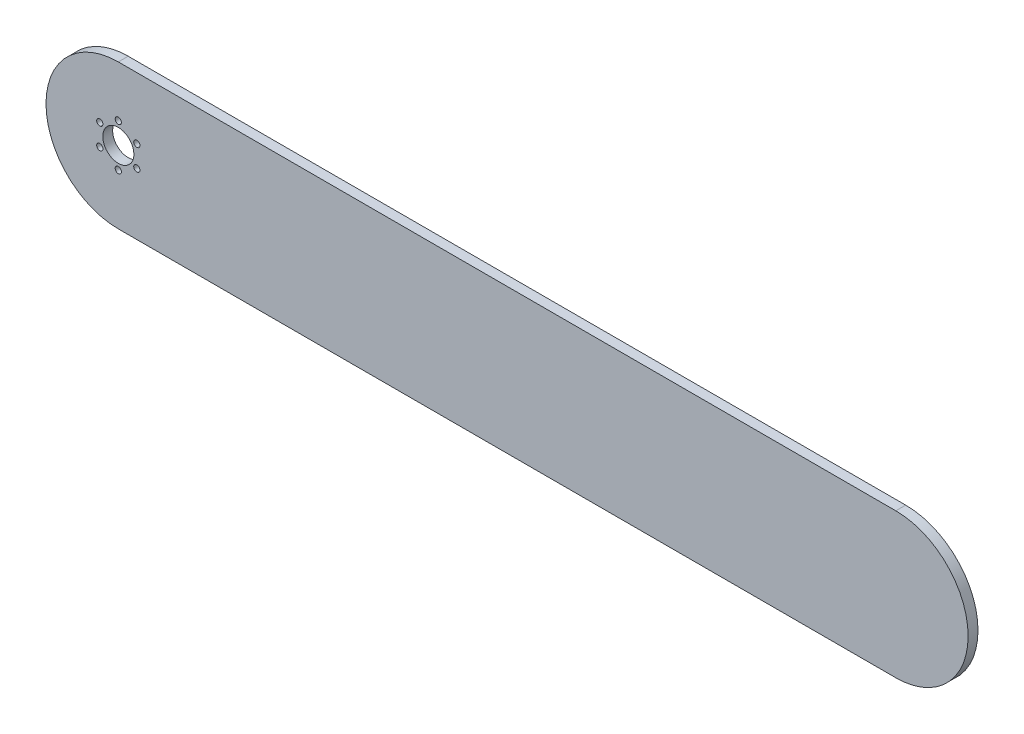
ISO-10303-21;
HEADER;
FILE_DESCRIPTION(('STEP AP214'),'2;1');
FILE_NAME('part.step','',(''),(''),'','','');
FILE_SCHEMA(('AUTOMOTIVE_DESIGN { 1 0 10303 214 1 1 1 1 }'));
ENDSEC;
DATA;
#1=APPLICATION_CONTEXT('core data for automotive mechanical design processes');
#2=APPLICATION_PROTOCOL_DEFINITION('international standard','automotive_design',2000,#1);
#3=PRODUCT_CONTEXT('',#1,'mechanical');
#4=PRODUCT('Part','Part','',(#3));
#5=PRODUCT_RELATED_PRODUCT_CATEGORY('part','',(#4));
#6=PRODUCT_DEFINITION_FORMATION('','',#4);
#7=PRODUCT_DEFINITION_CONTEXT('part definition',#1,'design');
#8=PRODUCT_DEFINITION('design','',#6,#7);
#9=PRODUCT_DEFINITION_SHAPE('','',#8);
#10=(LENGTH_UNIT() NAMED_UNIT(*) SI_UNIT(.MILLI.,.METRE.));
#11=(NAMED_UNIT(*) PLANE_ANGLE_UNIT() SI_UNIT($,.RADIAN.));
#12=(NAMED_UNIT(*) SI_UNIT($,.STERADIAN.) SOLID_ANGLE_UNIT());
#13=UNCERTAINTY_MEASURE_WITH_UNIT(LENGTH_MEASURE(1.E-05),#10,'distance_accuracy_value','');
#14=(GEOMETRIC_REPRESENTATION_CONTEXT(3) GLOBAL_UNCERTAINTY_ASSIGNED_CONTEXT((#13)) GLOBAL_UNIT_ASSIGNED_CONTEXT((#10,
#11,#12)) REPRESENTATION_CONTEXT('',''));
#15=CARTESIAN_POINT('',(0.,0.,0.));
#16=DIRECTION('',(0.,0.,1.));
#17=DIRECTION('',(1.,0.,0.));
#18=AXIS2_PLACEMENT_3D('',#15,#16,#17);
#19=CARTESIAN_POINT('',(0.,0.,6.35));
#20=DIRECTION('',(0.,0.,1.));
#21=DIRECTION('',(1.,0.,0.));
#22=AXIS2_PLACEMENT_3D('',#19,#20,#21);
#23=PLANE('',#22);
#24=CARTESIAN_POINT('',(-11.907849302036,-6.87500000000001,6.35));
#25=DIRECTION('',(0.,0.,1.));
#26=DIRECTION('',(1.,0.,0.));
#27=AXIS2_PLACEMENT_3D('',#24,#25,#26);
#28=CIRCLE('',#27,2.);
#29=CARTESIAN_POINT('',(-9.90784930203603,-6.87500000000001,6.35));
#30=VERTEX_POINT('',#29);
#31=EDGE_CURVE('E143',#30,#30,#28,.T.);
#32=ORIENTED_EDGE('',*,*,#31,.F.);
#33=EDGE_LOOP('',(#32));
#34=FACE_BOUND('',#33,.T.);
#35=CARTESIAN_POINT('',(11.907849302036,-6.875,6.35));
#36=DIRECTION('',(0.,0.,1.));
#37=DIRECTION('',(1.,0.,0.));
#38=AXIS2_PLACEMENT_3D('',#35,#36,#37);
#39=CIRCLE('',#38,2.);
#40=CARTESIAN_POINT('',(13.907849302036,-6.875,6.35));
#41=VERTEX_POINT('',#40);
#42=EDGE_CURVE('E131',#41,#41,#39,.T.);
#43=ORIENTED_EDGE('',*,*,#42,.F.);
#44=EDGE_LOOP('',(#43));
#45=FACE_BOUND('',#44,.T.);
#46=CARTESIAN_POINT('',(0.,13.75,6.35));
#47=DIRECTION('',(0.,0.,1.));
#48=DIRECTION('',(1.,0.,0.));
#49=AXIS2_PLACEMENT_3D('',#46,#47,#48);
#50=CIRCLE('',#49,2.);
#51=CARTESIAN_POINT('',(2.,13.75,6.35));
#52=VERTEX_POINT('',#51);
#53=EDGE_CURVE('E119',#52,#52,#50,.T.);
#54=ORIENTED_EDGE('',*,*,#53,.F.);
#55=EDGE_LOOP('',(#54));
#56=FACE_BOUND('',#55,.T.);
#57=CARTESIAN_POINT('',(0.,0.,6.35));
#58=DIRECTION('',(0.,0.,1.));
#59=DIRECTION('',(1.,0.,0.));
#60=AXIS2_PLACEMENT_3D('',#57,#58,#59);
#61=CIRCLE('',#60,46.5);
#62=CARTESIAN_POINT('',(0.,46.5,6.35));
#63=VERTEX_POINT('',#62);
#64=CARTESIAN_POINT('',(0.,-46.5,6.35));
#65=VERTEX_POINT('',#64);
#66=EDGE_CURVE('E89',#63,#65,#61,.T.);
#67=ORIENTED_EDGE('',*,*,#66,.T.);
#68=DIRECTION('',(1.,0.,0.));
#69=VECTOR('',#68,1.);
#70=CARTESIAN_POINT('',(0.,-46.5,6.35));
#71=LINE('',#70,#69);
#72=CARTESIAN_POINT('',(500.,-46.5,6.35));
#73=VERTEX_POINT('',#72);
#74=EDGE_CURVE('E84',#65,#73,#71,.T.);
#75=ORIENTED_EDGE('',*,*,#74,.T.);
#76=CARTESIAN_POINT('',(500.,0.,6.35));
#77=DIRECTION('',(0.,0.,1.));
#78=DIRECTION('',(1.,0.,0.));
#79=AXIS2_PLACEMENT_3D('',#76,#77,#78);
#80=CIRCLE('',#79,46.5);
#81=CARTESIAN_POINT('',(500.,46.5,6.35));
#82=VERTEX_POINT('',#81);
#83=EDGE_CURVE('E87',#73,#82,#80,.T.);
#84=ORIENTED_EDGE('',*,*,#83,.T.);
#85=DIRECTION('',(-1.,0.,0.));
#86=VECTOR('',#85,1.);
#87=CARTESIAN_POINT('',(0.,46.5,6.35));
#88=LINE('',#87,#86);
#89=EDGE_CURVE('E54',#82,#63,#88,.T.);
#90=ORIENTED_EDGE('',*,*,#89,.T.);
#91=EDGE_LOOP('',(#67,#75,#84,#90));
#92=FACE_BOUND('',#91,.T.);
#93=CARTESIAN_POINT('',(0.,0.,6.35));
#94=DIRECTION('',(0.,0.,1.));
#95=DIRECTION('',(1.,0.,0.));
#96=AXIS2_PLACEMENT_3D('',#93,#94,#95);
#97=CIRCLE('',#96,10.);
#98=CARTESIAN_POINT('',(10.,0.,6.35));
#99=VERTEX_POINT('',#98);
#100=EDGE_CURVE('E104',#99,#99,#97,.T.);
#101=ORIENTED_EDGE('',*,*,#100,.F.);
#102=EDGE_LOOP('',(#101));
#103=FACE_BOUND('',#102,.T.);
#104=CARTESIAN_POINT('',(11.907849302036,6.875,6.35));
#105=DIRECTION('',(0.,0.,1.));
#106=DIRECTION('',(1.,0.,0.));
#107=AXIS2_PLACEMENT_3D('',#104,#105,#106);
#108=CIRCLE('',#107,1.99999999999924);
#109=CARTESIAN_POINT('',(13.9078493020353,6.875,6.35));
#110=VERTEX_POINT('',#109);
#111=EDGE_CURVE('E125',#110,#110,#108,.T.);
#112=ORIENTED_EDGE('',*,*,#111,.F.);
#113=EDGE_LOOP('',(#112));
#114=FACE_BOUND('',#113,.T.);
#115=CARTESIAN_POINT('',(0.,-13.75,6.35));
#116=DIRECTION('',(0.,0.,1.));
#117=DIRECTION('',(1.,0.,0.));
#118=AXIS2_PLACEMENT_3D('',#115,#116,#117);
#119=CIRCLE('',#118,2.00000000000013);
#120=CARTESIAN_POINT('',(2.00000000000013,-13.75,6.35));
#121=VERTEX_POINT('',#120);
#122=EDGE_CURVE('E137',#121,#121,#119,.T.);
#123=ORIENTED_EDGE('',*,*,#122,.F.);
#124=EDGE_LOOP('',(#123));
#125=FACE_BOUND('',#124,.T.);
#126=CARTESIAN_POINT('',(-11.907849302036,6.87499999999999,6.35));
#127=DIRECTION('',(0.,0.,1.));
#128=DIRECTION('',(1.,0.,0.));
#129=AXIS2_PLACEMENT_3D('',#126,#127,#128);
#130=CIRCLE('',#129,2.00000000000043);
#131=CARTESIAN_POINT('',(-9.9078493020356,6.87499999999999,6.35));
#132=VERTEX_POINT('',#131);
#133=EDGE_CURVE('E149',#132,#132,#130,.T.);
#134=ORIENTED_EDGE('',*,*,#133,.F.);
#135=EDGE_LOOP('',(#134));
#136=FACE_BOUND('',#135,.T.);
#137=ADVANCED_FACE('F37',(#34,#45,#56,#92,#103,#114,#125,#136),#23,.T.);
#138=CARTESIAN_POINT('',(0.,0.,0.));
#139=DIRECTION('',(0.,0.,1.));
#140=DIRECTION('',(1.,0.,0.));
#141=AXIS2_PLACEMENT_3D('',#138,#139,#140);
#142=PLANE('',#141);
#143=CARTESIAN_POINT('',(0.,0.,0.));
#144=DIRECTION('',(0.,0.,1.));
#145=DIRECTION('',(1.,0.,0.));
#146=AXIS2_PLACEMENT_3D('',#143,#144,#145);
#147=CIRCLE('',#146,46.5);
#148=CARTESIAN_POINT('',(0.,46.5,0.));
#149=VERTEX_POINT('',#148);
#150=CARTESIAN_POINT('',(0.,-46.5,0.));
#151=VERTEX_POINT('',#150);
#152=EDGE_CURVE('E101',#149,#151,#147,.T.);
#153=ORIENTED_EDGE('',*,*,#152,.F.);
#154=DIRECTION('',(-1.,0.,0.));
#155=VECTOR('',#154,1.);
#156=CARTESIAN_POINT('',(0.,46.5,0.));
#157=LINE('',#156,#155);
#158=CARTESIAN_POINT('',(500.,46.5,0.));
#159=VERTEX_POINT('',#158);
#160=EDGE_CURVE('E77',#159,#149,#157,.T.);
#161=ORIENTED_EDGE('',*,*,#160,.F.);
#162=CARTESIAN_POINT('',(500.,0.,0.));
#163=DIRECTION('',(0.,0.,1.));
#164=DIRECTION('',(1.,0.,0.));
#165=AXIS2_PLACEMENT_3D('',#162,#163,#164);
#166=CIRCLE('',#165,46.5);
#167=CARTESIAN_POINT('',(500.,-46.5,0.));
#168=VERTEX_POINT('',#167);
#169=EDGE_CURVE('E71',#168,#159,#166,.T.);
#170=ORIENTED_EDGE('',*,*,#169,.F.);
#171=DIRECTION('',(1.,0.,0.));
#172=VECTOR('',#171,1.);
#173=CARTESIAN_POINT('',(0.,-46.5,0.));
#174=LINE('',#173,#172);
#175=EDGE_CURVE('E93',#151,#168,#174,.T.);
#176=ORIENTED_EDGE('',*,*,#175,.F.);
#177=EDGE_LOOP('',(#153,#161,#170,#176));
#178=FACE_BOUND('',#177,.T.);
#179=CARTESIAN_POINT('',(0.,0.,0.));
#180=DIRECTION('',(0.,0.,1.));
#181=DIRECTION('',(1.,0.,0.));
#182=AXIS2_PLACEMENT_3D('',#179,#180,#181);
#183=CIRCLE('',#182,10.);
#184=CARTESIAN_POINT('',(10.,0.,0.));
#185=VERTEX_POINT('',#184);
#186=EDGE_CURVE('E116',#185,#185,#183,.T.);
#187=ORIENTED_EDGE('',*,*,#186,.T.);
#188=EDGE_LOOP('',(#187));
#189=FACE_BOUND('',#188,.T.);
#190=CARTESIAN_POINT('',(0.,13.75,0.));
#191=DIRECTION('',(0.,0.,1.));
#192=DIRECTION('',(1.,0.,0.));
#193=AXIS2_PLACEMENT_3D('',#190,#191,#192);
#194=CIRCLE('',#193,2.);
#195=CARTESIAN_POINT('',(2.,13.75,0.));
#196=VERTEX_POINT('',#195);
#197=EDGE_CURVE('E122',#196,#196,#194,.T.);
#198=ORIENTED_EDGE('',*,*,#197,.T.);
#199=EDGE_LOOP('',(#198));
#200=FACE_BOUND('',#199,.T.);
#201=CARTESIAN_POINT('',(11.907849302036,6.875,0.));
#202=DIRECTION('',(0.,0.,1.));
#203=DIRECTION('',(1.,0.,0.));
#204=AXIS2_PLACEMENT_3D('',#201,#202,#203);
#205=CIRCLE('',#204,1.99999999999924);
#206=CARTESIAN_POINT('',(13.9078493020353,6.875,0.));
#207=VERTEX_POINT('',#206);
#208=EDGE_CURVE('E128',#207,#207,#205,.T.);
#209=ORIENTED_EDGE('',*,*,#208,.T.);
#210=EDGE_LOOP('',(#209));
#211=FACE_BOUND('',#210,.T.);
#212=CARTESIAN_POINT('',(11.907849302036,-6.875,0.));
#213=DIRECTION('',(0.,0.,1.));
#214=DIRECTION('',(1.,0.,0.));
#215=AXIS2_PLACEMENT_3D('',#212,#213,#214);
#216=CIRCLE('',#215,2.);
#217=CARTESIAN_POINT('',(13.907849302036,-6.875,0.));
#218=VERTEX_POINT('',#217);
#219=EDGE_CURVE('E134',#218,#218,#216,.T.);
#220=ORIENTED_EDGE('',*,*,#219,.T.);
#221=EDGE_LOOP('',(#220));
#222=FACE_BOUND('',#221,.T.);
#223=CARTESIAN_POINT('',(0.,-13.75,0.));
#224=DIRECTION('',(0.,0.,1.));
#225=DIRECTION('',(1.,0.,0.));
#226=AXIS2_PLACEMENT_3D('',#223,#224,#225);
#227=CIRCLE('',#226,2.00000000000013);
#228=CARTESIAN_POINT('',(2.00000000000013,-13.75,0.));
#229=VERTEX_POINT('',#228);
#230=EDGE_CURVE('E140',#229,#229,#227,.T.);
#231=ORIENTED_EDGE('',*,*,#230,.T.);
#232=EDGE_LOOP('',(#231));
#233=FACE_BOUND('',#232,.T.);
#234=CARTESIAN_POINT('',(-11.907849302036,-6.87500000000001,0.));
#235=DIRECTION('',(0.,0.,1.));
#236=DIRECTION('',(1.,0.,0.));
#237=AXIS2_PLACEMENT_3D('',#234,#235,#236);
#238=CIRCLE('',#237,2.);
#239=CARTESIAN_POINT('',(-9.90784930203603,-6.87500000000001,0.));
#240=VERTEX_POINT('',#239);
#241=EDGE_CURVE('E146',#240,#240,#238,.T.);
#242=ORIENTED_EDGE('',*,*,#241,.T.);
#243=EDGE_LOOP('',(#242));
#244=FACE_BOUND('',#243,.T.);
#245=CARTESIAN_POINT('',(-11.907849302036,6.87499999999999,0.));
#246=DIRECTION('',(0.,0.,1.));
#247=DIRECTION('',(1.,0.,0.));
#248=AXIS2_PLACEMENT_3D('',#245,#246,#247);
#249=CIRCLE('',#248,2.00000000000043);
#250=CARTESIAN_POINT('',(-9.9078493020356,6.87499999999999,0.));
#251=VERTEX_POINT('',#250);
#252=EDGE_CURVE('E152',#251,#251,#249,.T.);
#253=ORIENTED_EDGE('',*,*,#252,.T.);
#254=EDGE_LOOP('',(#253));
#255=FACE_BOUND('',#254,.T.);
#256=ADVANCED_FACE('F112',(#178,#189,#200,#211,#222,#233,#244,#255),#142,.F.);
#257=CARTESIAN_POINT('',(0.,0.,6.35));
#258=DIRECTION('',(0.,0.,-1.));
#259=DIRECTION('',(-1.,0.,0.));
#260=AXIS2_PLACEMENT_3D('',#257,#258,#259);
#261=CYLINDRICAL_SURFACE('',#260,46.5);
#262=ORIENTED_EDGE('',*,*,#152,.T.);
#263=DIRECTION('',(0.,0.,-1.));
#264=VECTOR('',#263,1.);
#265=CARTESIAN_POINT('',(0.,-46.5,6.35));
#266=LINE('',#265,#264);
#267=EDGE_CURVE('E11',#65,#151,#266,.T.);
#268=ORIENTED_EDGE('',*,*,#267,.F.);
#269=ORIENTED_EDGE('',*,*,#66,.F.);
#270=DIRECTION('',(0.,0.,-1.));
#271=VECTOR('',#270,1.);
#272=CARTESIAN_POINT('',(0.,46.5,6.35));
#273=LINE('',#272,#271);
#274=EDGE_CURVE('E97',#63,#149,#273,.T.);
#275=ORIENTED_EDGE('',*,*,#274,.T.);
#276=EDGE_LOOP('',(#262,#268,#269,#275));
#277=FACE_BOUND('',#276,.T.);
#278=ADVANCED_FACE('F39',(#277),#261,.T.);
#279=CARTESIAN_POINT('',(0.,-46.5,6.35));
#280=DIRECTION('',(0.,1.,0.));
#281=DIRECTION('',(0.,0.,1.));
#282=AXIS2_PLACEMENT_3D('',#279,#280,#281);
#283=PLANE('',#282);
#284=ORIENTED_EDGE('',*,*,#175,.T.);
#285=DIRECTION('',(0.,0.,-1.));
#286=VECTOR('',#285,1.);
#287=CARTESIAN_POINT('',(500.,-46.5,6.35));
#288=LINE('',#287,#286);
#289=EDGE_CURVE('E46',#73,#168,#288,.T.);
#290=ORIENTED_EDGE('',*,*,#289,.F.);
#291=ORIENTED_EDGE('',*,*,#74,.F.);
#292=ORIENTED_EDGE('',*,*,#267,.T.);
#293=EDGE_LOOP('',(#284,#290,#291,#292));
#294=FACE_BOUND('',#293,.T.);
#295=ADVANCED_FACE('F92',(#294),#283,.F.);
#296=CARTESIAN_POINT('',(500.,0.,6.35));
#297=DIRECTION('',(0.,0.,-1.));
#298=DIRECTION('',(-1.,0.,0.));
#299=AXIS2_PLACEMENT_3D('',#296,#297,#298);
#300=CYLINDRICAL_SURFACE('',#299,46.5);
#301=ORIENTED_EDGE('',*,*,#169,.T.);
#302=DIRECTION('',(0.,0.,-1.));
#303=VECTOR('',#302,1.);
#304=CARTESIAN_POINT('',(500.,46.5,6.35));
#305=LINE('',#304,#303);
#306=EDGE_CURVE('E94',#82,#159,#305,.T.);
#307=ORIENTED_EDGE('',*,*,#306,.F.);
#308=ORIENTED_EDGE('',*,*,#83,.F.);
#309=ORIENTED_EDGE('',*,*,#289,.T.);
#310=EDGE_LOOP('',(#301,#307,#308,#309));
#311=FACE_BOUND('',#310,.T.);
#312=ADVANCED_FACE('F95',(#311),#300,.T.);
#313=CARTESIAN_POINT('',(0.,46.5,6.35));
#314=DIRECTION('',(0.,-1.,0.));
#315=DIRECTION('',(0.,0.,-1.));
#316=AXIS2_PLACEMENT_3D('',#313,#314,#315);
#317=PLANE('',#316);
#318=ORIENTED_EDGE('',*,*,#160,.T.);
#319=ORIENTED_EDGE('',*,*,#274,.F.);
#320=ORIENTED_EDGE('',*,*,#89,.F.);
#321=ORIENTED_EDGE('',*,*,#306,.T.);
#322=EDGE_LOOP('',(#318,#319,#320,#321));
#323=FACE_BOUND('',#322,.T.);
#324=ADVANCED_FACE('F109',(#323),#317,.F.);
#325=CARTESIAN_POINT('',(0.,0.,6.35));
#326=DIRECTION('',(0.,0.,-1.));
#327=DIRECTION('',(-1.,0.,0.));
#328=AXIS2_PLACEMENT_3D('',#325,#326,#327);
#329=CYLINDRICAL_SURFACE('',#328,10.);
#330=ORIENTED_EDGE('',*,*,#100,.T.);
#331=EDGE_LOOP('',(#330));
#332=FACE_BOUND('',#331,.T.);
#333=ORIENTED_EDGE('',*,*,#186,.F.);
#334=EDGE_LOOP('',(#333));
#335=FACE_BOUND('',#334,.T.);
#336=ADVANCED_FACE('F171',(#332,#335),#329,.F.);
#337=CARTESIAN_POINT('',(0.,13.75,6.35));
#338=DIRECTION('',(0.,0.,-1.));
#339=DIRECTION('',(-1.,0.,0.));
#340=AXIS2_PLACEMENT_3D('',#337,#338,#339);
#341=CYLINDRICAL_SURFACE('',#340,2.);
#342=ORIENTED_EDGE('',*,*,#53,.T.);
#343=EDGE_LOOP('',(#342));
#344=FACE_BOUND('',#343,.T.);
#345=ORIENTED_EDGE('',*,*,#197,.F.);
#346=EDGE_LOOP('',(#345));
#347=FACE_BOUND('',#346,.T.);
#348=ADVANCED_FACE('F225',(#344,#347),#341,.F.);
#349=CARTESIAN_POINT('',(11.907849302036,6.875,6.35));
#350=DIRECTION('',(0.,0.,-1.));
#351=DIRECTION('',(-1.,0.,0.));
#352=AXIS2_PLACEMENT_3D('',#349,#350,#351);
#353=CYLINDRICAL_SURFACE('',#352,1.99999999999924);
#354=ORIENTED_EDGE('',*,*,#111,.T.);
#355=EDGE_LOOP('',(#354));
#356=FACE_BOUND('',#355,.T.);
#357=ORIENTED_EDGE('',*,*,#208,.F.);
#358=EDGE_LOOP('',(#357));
#359=FACE_BOUND('',#358,.T.);
#360=ADVANCED_FACE('F234',(#356,#359),#353,.F.);
#361=CARTESIAN_POINT('',(11.907849302036,-6.875,6.35));
#362=DIRECTION('',(0.,0.,-1.));
#363=DIRECTION('',(-1.,0.,0.));
#364=AXIS2_PLACEMENT_3D('',#361,#362,#363);
#365=CYLINDRICAL_SURFACE('',#364,2.);
#366=ORIENTED_EDGE('',*,*,#42,.T.);
#367=EDGE_LOOP('',(#366));
#368=FACE_BOUND('',#367,.T.);
#369=ORIENTED_EDGE('',*,*,#219,.F.);
#370=EDGE_LOOP('',(#369));
#371=FACE_BOUND('',#370,.T.);
#372=ADVANCED_FACE('F243',(#368,#371),#365,.F.);
#373=CARTESIAN_POINT('',(0.,-13.75,6.35));
#374=DIRECTION('',(0.,0.,-1.));
#375=DIRECTION('',(-1.,0.,0.));
#376=AXIS2_PLACEMENT_3D('',#373,#374,#375);
#377=CYLINDRICAL_SURFACE('',#376,2.00000000000013);
#378=ORIENTED_EDGE('',*,*,#122,.T.);
#379=EDGE_LOOP('',(#378));
#380=FACE_BOUND('',#379,.T.);
#381=ORIENTED_EDGE('',*,*,#230,.F.);
#382=EDGE_LOOP('',(#381));
#383=FACE_BOUND('',#382,.T.);
#384=ADVANCED_FACE('F253',(#380,#383),#377,.F.);
#385=CARTESIAN_POINT('',(-11.907849302036,-6.87500000000001,6.35));
#386=DIRECTION('',(0.,0.,-1.));
#387=DIRECTION('',(-1.,0.,0.));
#388=AXIS2_PLACEMENT_3D('',#385,#386,#387);
#389=CYLINDRICAL_SURFACE('',#388,2.);
#390=ORIENTED_EDGE('',*,*,#31,.T.);
#391=EDGE_LOOP('',(#390));
#392=FACE_BOUND('',#391,.T.);
#393=ORIENTED_EDGE('',*,*,#241,.F.);
#394=EDGE_LOOP('',(#393));
#395=FACE_BOUND('',#394,.T.);
#396=ADVANCED_FACE('F263',(#392,#395),#389,.F.);
#397=CARTESIAN_POINT('',(-11.907849302036,6.87499999999999,6.35));
#398=DIRECTION('',(0.,0.,-1.));
#399=DIRECTION('',(-1.,0.,0.));
#400=AXIS2_PLACEMENT_3D('',#397,#398,#399);
#401=CYLINDRICAL_SURFACE('',#400,2.00000000000043);
#402=ORIENTED_EDGE('',*,*,#133,.T.);
#403=EDGE_LOOP('',(#402));
#404=FACE_BOUND('',#403,.T.);
#405=ORIENTED_EDGE('',*,*,#252,.F.);
#406=EDGE_LOOP('',(#405));
#407=FACE_BOUND('',#406,.T.);
#408=ADVANCED_FACE('F158',(#404,#407),#401,.F.);
#409=CLOSED_SHELL('',(#137,#256,#278,#295,#312,#324,#336,#348,#360,#372,#384,#396,#408));
#410=MANIFOLD_SOLID_BREP('B2',#409);
#411=ADVANCED_BREP_SHAPE_REPRESENTATION('',(#18,#410),#14);
#412=SHAPE_DEFINITION_REPRESENTATION(#9,#411);
ENDSEC;
END-ISO-10303-21;
